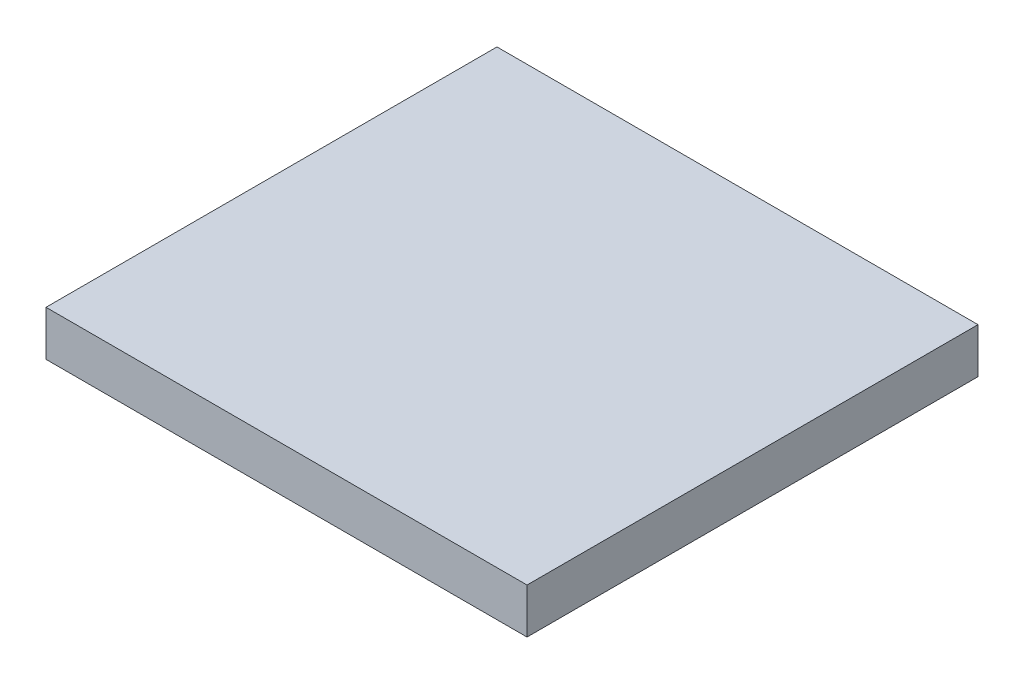
ISO-10303-21;
HEADER;
FILE_DESCRIPTION(('STEP AP214'),'2;1');
FILE_NAME('part.step','',(''),(''),'','','');
FILE_SCHEMA(('AUTOMOTIVE_DESIGN { 1 0 10303 214 1 1 1 1 }'));
ENDSEC;
DATA;
#1=APPLICATION_CONTEXT('core data for automotive mechanical design processes');
#2=APPLICATION_PROTOCOL_DEFINITION('international standard','automotive_design',2000,#1);
#3=PRODUCT_CONTEXT('',#1,'mechanical');
#4=PRODUCT('Part','Part','',(#3));
#5=PRODUCT_RELATED_PRODUCT_CATEGORY('part','',(#4));
#6=PRODUCT_DEFINITION_FORMATION('','',#4);
#7=PRODUCT_DEFINITION_CONTEXT('part definition',#1,'design');
#8=PRODUCT_DEFINITION('design','',#6,#7);
#9=PRODUCT_DEFINITION_SHAPE('','',#8);
#10=(LENGTH_UNIT() NAMED_UNIT(*) SI_UNIT(.MILLI.,.METRE.));
#11=(NAMED_UNIT(*) PLANE_ANGLE_UNIT() SI_UNIT($,.RADIAN.));
#12=(NAMED_UNIT(*) SI_UNIT($,.STERADIAN.) SOLID_ANGLE_UNIT());
#13=UNCERTAINTY_MEASURE_WITH_UNIT(LENGTH_MEASURE(1.E-05),#10,'distance_accuracy_value','');
#14=(GEOMETRIC_REPRESENTATION_CONTEXT(3) GLOBAL_UNCERTAINTY_ASSIGNED_CONTEXT((#13)) GLOBAL_UNIT_ASSIGNED_CONTEXT((#10,
#11,#12)) REPRESENTATION_CONTEXT('',''));
#15=CARTESIAN_POINT('',(0.,0.,0.));
#16=DIRECTION('',(0.,0.,1.));
#17=DIRECTION('',(1.,0.,0.));
#18=AXIS2_PLACEMENT_3D('',#15,#16,#17);
#19=CARTESIAN_POINT('',(-80.,15.,75.));
#20=DIRECTION('',(1.,0.,0.));
#21=DIRECTION('',(0.,0.,-1.));
#22=AXIS2_PLACEMENT_3D('',#19,#20,#21);
#23=PLANE('',#22);
#24=DIRECTION('',(0.,0.,1.));
#25=VECTOR('',#24,1.);
#26=CARTESIAN_POINT('',(-80.,0.,75.));
#27=LINE('',#26,#25);
#28=CARTESIAN_POINT('',(-80.,0.,-75.));
#29=VERTEX_POINT('',#28);
#30=CARTESIAN_POINT('',(-80.,0.,75.));
#31=VERTEX_POINT('',#30);
#32=EDGE_CURVE('E94',#29,#31,#27,.T.);
#33=ORIENTED_EDGE('',*,*,#32,.T.);
#34=DIRECTION('',(0.,-1.,0.));
#35=VECTOR('',#34,1.);
#36=CARTESIAN_POINT('',(-80.,15.,75.));
#37=LINE('',#36,#35);
#38=CARTESIAN_POINT('',(-80.,15.,75.));
#39=VERTEX_POINT('',#38);
#40=EDGE_CURVE('E11',#39,#31,#37,.T.);
#41=ORIENTED_EDGE('',*,*,#40,.F.);
#42=DIRECTION('',(0.,0.,1.));
#43=VECTOR('',#42,1.);
#44=CARTESIAN_POINT('',(-80.,15.,75.));
#45=LINE('',#44,#43);
#46=CARTESIAN_POINT('',(-80.,15.,-75.));
#47=VERTEX_POINT('',#46);
#48=EDGE_CURVE('E82',#47,#39,#45,.T.);
#49=ORIENTED_EDGE('',*,*,#48,.F.);
#50=DIRECTION('',(0.,-1.,0.));
#51=VECTOR('',#50,1.);
#52=CARTESIAN_POINT('',(-80.,15.,-75.));
#53=LINE('',#52,#51);
#54=EDGE_CURVE('E90',#47,#29,#53,.T.);
#55=ORIENTED_EDGE('',*,*,#54,.T.);
#56=EDGE_LOOP('',(#33,#41,#49,#55));
#57=FACE_BOUND('',#56,.T.);
#58=ADVANCED_FACE('F31',(#57),#23,.F.);
#59=CARTESIAN_POINT('',(80.,15.,75.));
#60=DIRECTION('',(0.,0.,-1.));
#61=DIRECTION('',(-1.,0.,0.));
#62=AXIS2_PLACEMENT_3D('',#59,#60,#61);
#63=PLANE('',#62);
#64=DIRECTION('',(1.,0.,0.));
#65=VECTOR('',#64,1.);
#66=CARTESIAN_POINT('',(80.,0.,75.));
#67=LINE('',#66,#65);
#68=CARTESIAN_POINT('',(80.,0.,75.));
#69=VERTEX_POINT('',#68);
#70=EDGE_CURVE('E86',#31,#69,#67,.T.);
#71=ORIENTED_EDGE('',*,*,#70,.T.);
#72=DIRECTION('',(0.,-1.,0.));
#73=VECTOR('',#72,1.);
#74=CARTESIAN_POINT('',(80.,15.,75.));
#75=LINE('',#74,#73);
#76=CARTESIAN_POINT('',(80.,15.,75.));
#77=VERTEX_POINT('',#76);
#78=EDGE_CURVE('E39',#77,#69,#75,.T.);
#79=ORIENTED_EDGE('',*,*,#78,.F.);
#80=DIRECTION('',(1.,0.,0.));
#81=VECTOR('',#80,1.);
#82=CARTESIAN_POINT('',(80.,15.,75.));
#83=LINE('',#82,#81);
#84=EDGE_CURVE('E77',#39,#77,#83,.T.);
#85=ORIENTED_EDGE('',*,*,#84,.F.);
#86=ORIENTED_EDGE('',*,*,#40,.T.);
#87=EDGE_LOOP('',(#71,#79,#85,#86));
#88=FACE_BOUND('',#87,.T.);
#89=ADVANCED_FACE('F85',(#88),#63,.F.);
#90=CARTESIAN_POINT('',(80.,15.,75.));
#91=DIRECTION('',(-1.,0.,0.));
#92=DIRECTION('',(0.,0.,1.));
#93=AXIS2_PLACEMENT_3D('',#90,#91,#92);
#94=PLANE('',#93);
#95=DIRECTION('',(0.,0.,-1.));
#96=VECTOR('',#95,1.);
#97=CARTESIAN_POINT('',(80.,0.,75.));
#98=LINE('',#97,#96);
#99=CARTESIAN_POINT('',(80.,0.,-75.));
#100=VERTEX_POINT('',#99);
#101=EDGE_CURVE('E64',#69,#100,#98,.T.);
#102=ORIENTED_EDGE('',*,*,#101,.T.);
#103=DIRECTION('',(0.,-1.,0.));
#104=VECTOR('',#103,1.);
#105=CARTESIAN_POINT('',(80.,15.,-75.));
#106=LINE('',#105,#104);
#107=CARTESIAN_POINT('',(80.,15.,-75.));
#108=VERTEX_POINT('',#107);
#109=EDGE_CURVE('E87',#108,#100,#106,.T.);
#110=ORIENTED_EDGE('',*,*,#109,.F.);
#111=DIRECTION('',(0.,0.,-1.));
#112=VECTOR('',#111,1.);
#113=CARTESIAN_POINT('',(80.,15.,75.));
#114=LINE('',#113,#112);
#115=EDGE_CURVE('E80',#77,#108,#114,.T.);
#116=ORIENTED_EDGE('',*,*,#115,.F.);
#117=ORIENTED_EDGE('',*,*,#78,.T.);
#118=EDGE_LOOP('',(#102,#110,#116,#117));
#119=FACE_BOUND('',#118,.T.);
#120=ADVANCED_FACE('F88',(#119),#94,.F.);
#121=CARTESIAN_POINT('',(80.,15.,-75.));
#122=DIRECTION('',(0.,0.,1.));
#123=DIRECTION('',(1.,0.,0.));
#124=AXIS2_PLACEMENT_3D('',#121,#122,#123);
#125=PLANE('',#124);
#126=DIRECTION('',(-1.,0.,0.));
#127=VECTOR('',#126,1.);
#128=CARTESIAN_POINT('',(80.,0.,-75.));
#129=LINE('',#128,#127);
#130=EDGE_CURVE('E70',#100,#29,#129,.T.);
#131=ORIENTED_EDGE('',*,*,#130,.T.);
#132=ORIENTED_EDGE('',*,*,#54,.F.);
#133=DIRECTION('',(-1.,0.,0.));
#134=VECTOR('',#133,1.);
#135=CARTESIAN_POINT('',(80.,15.,-75.));
#136=LINE('',#135,#134);
#137=EDGE_CURVE('E47',#108,#47,#136,.T.);
#138=ORIENTED_EDGE('',*,*,#137,.F.);
#139=ORIENTED_EDGE('',*,*,#109,.T.);
#140=EDGE_LOOP('',(#131,#132,#138,#139));
#141=FACE_BOUND('',#140,.T.);
#142=ADVANCED_FACE('F101',(#141),#125,.F.);
#143=CARTESIAN_POINT('',(-80.,15.,-75.));
#144=DIRECTION('',(0.,1.,0.));
#145=DIRECTION('',(0.,0.,1.));
#146=AXIS2_PLACEMENT_3D('',#143,#144,#145);
#147=PLANE('',#146);
#148=ORIENTED_EDGE('',*,*,#48,.T.);
#149=ORIENTED_EDGE('',*,*,#84,.T.);
#150=ORIENTED_EDGE('',*,*,#115,.T.);
#151=ORIENTED_EDGE('',*,*,#137,.T.);
#152=EDGE_LOOP('',(#148,#149,#150,#151));
#153=FACE_BOUND('',#152,.T.);
#154=ADVANCED_FACE('F78',(#153),#147,.T.);
#155=CARTESIAN_POINT('',(-80.,0.,-75.));
#156=DIRECTION('',(0.,1.,0.));
#157=DIRECTION('',(0.,0.,1.));
#158=AXIS2_PLACEMENT_3D('',#155,#156,#157);
#159=PLANE('',#158);
#160=ORIENTED_EDGE('',*,*,#32,.F.);
#161=ORIENTED_EDGE('',*,*,#130,.F.);
#162=ORIENTED_EDGE('',*,*,#101,.F.);
#163=ORIENTED_EDGE('',*,*,#70,.F.);
#164=EDGE_LOOP('',(#160,#161,#162,#163));
#165=FACE_BOUND('',#164,.T.);
#166=ADVANCED_FACE('F104',(#165),#159,.F.);
#167=CLOSED_SHELL('',(#58,#89,#120,#142,#154,#166));
#168=MANIFOLD_SOLID_BREP('B2',#167);
#169=ADVANCED_BREP_SHAPE_REPRESENTATION('',(#18,#168),#14);
#170=SHAPE_DEFINITION_REPRESENTATION(#9,#169);
ENDSEC;
END-ISO-10303-21;
